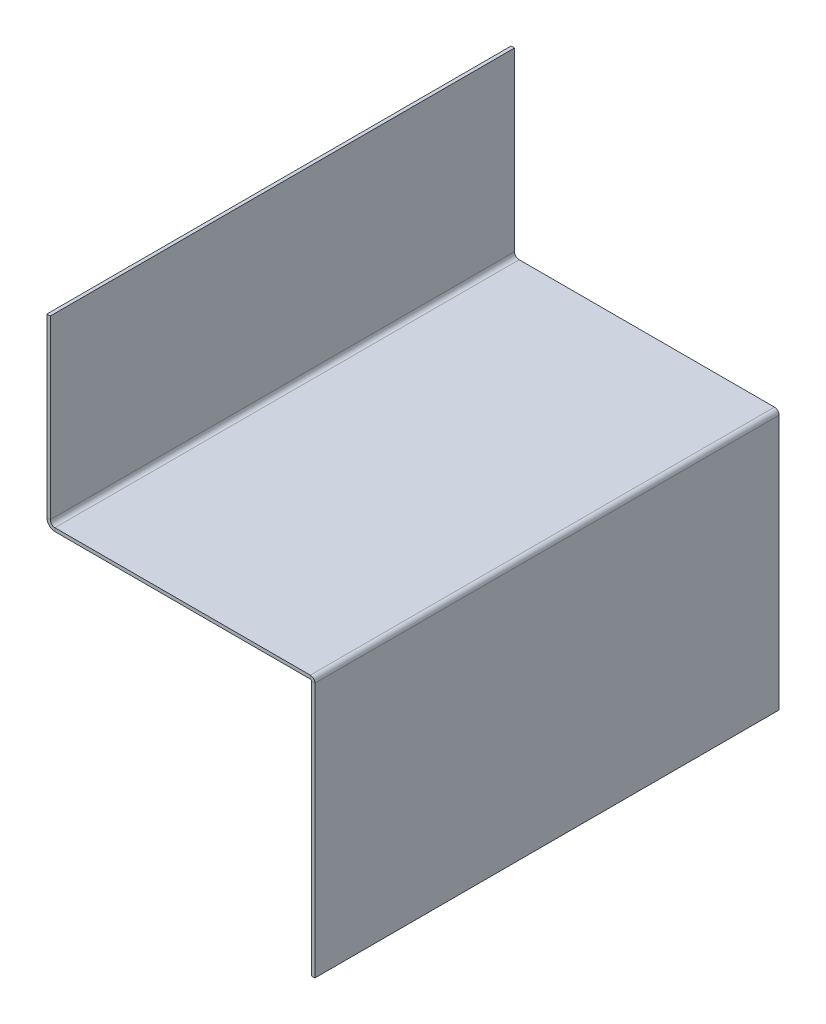
ISO-10303-21;
HEADER;
FILE_DESCRIPTION(('STEP AP214'),'2;1');
FILE_NAME('part.step','',(''),(''),'','','');
FILE_SCHEMA(('AUTOMOTIVE_DESIGN { 1 0 10303 214 1 1 1 1 }'));
ENDSEC;
DATA;
#1=APPLICATION_CONTEXT('core data for automotive mechanical design processes');
#2=APPLICATION_PROTOCOL_DEFINITION('international standard','automotive_design',2000,#1);
#3=PRODUCT_CONTEXT('',#1,'mechanical');
#4=PRODUCT('Part','Part','',(#3));
#5=PRODUCT_RELATED_PRODUCT_CATEGORY('part','',(#4));
#6=PRODUCT_DEFINITION_FORMATION('','',#4);
#7=PRODUCT_DEFINITION_CONTEXT('part definition',#1,'design');
#8=PRODUCT_DEFINITION('design','',#6,#7);
#9=PRODUCT_DEFINITION_SHAPE('','',#8);
#10=(LENGTH_UNIT() NAMED_UNIT(*) SI_UNIT(.MILLI.,.METRE.));
#11=(NAMED_UNIT(*) PLANE_ANGLE_UNIT() SI_UNIT($,.RADIAN.));
#12=(NAMED_UNIT(*) SI_UNIT($,.STERADIAN.) SOLID_ANGLE_UNIT());
#13=UNCERTAINTY_MEASURE_WITH_UNIT(LENGTH_MEASURE(1.E-05),#10,'distance_accuracy_value','');
#14=(GEOMETRIC_REPRESENTATION_CONTEXT(3) GLOBAL_UNCERTAINTY_ASSIGNED_CONTEXT((#13)) GLOBAL_UNIT_ASSIGNED_CONTEXT((#10,
#11,#12)) REPRESENTATION_CONTEXT('',''));
#15=CARTESIAN_POINT('',(0.,0.,0.));
#16=DIRECTION('',(0.,0.,1.));
#17=DIRECTION('',(1.,0.,0.));
#18=AXIS2_PLACEMENT_3D('',#15,#16,#17);
#19=CARTESIAN_POINT('',(1.00000000000001,0.,50.));
#20=DIRECTION('',(0.,0.,1.));
#21=DIRECTION('',(1.,0.,0.));
#22=AXIS2_PLACEMENT_3D('',#19,#20,#21);
#23=PLANE('',#22);
#24=DIRECTION('',(0.,-1.,0.));
#25=VECTOR('',#24,1.);
#26=CARTESIAN_POINT('',(1.00000000000001,0.,50.));
#27=LINE('',#26,#25);
#28=CARTESIAN_POINT('',(1.00000000000001,0.,50.));
#29=VERTEX_POINT('',#28);
#30=CARTESIAN_POINT('',(1.00000000000001,-0.7366,50.));
#31=VERTEX_POINT('',#30);
#32=EDGE_CURVE('E11',#29,#31,#27,.T.);
#33=ORIENTED_EDGE('',*,*,#32,.F.);
#34=CARTESIAN_POINT('',(1.,1.,50.));
#35=DIRECTION('',(0.,0.,1.));
#36=DIRECTION('',(-1.,0.,0.));
#37=AXIS2_PLACEMENT_3D('',#34,#35,#36);
#38=CIRCLE('',#37,1.);
#39=CARTESIAN_POINT('',(0.,1.00000000000001,50.));
#40=VERTEX_POINT('',#39);
#41=EDGE_CURVE('E247',#40,#29,#38,.T.);
#42=ORIENTED_EDGE('',*,*,#41,.F.);
#43=DIRECTION('',(1.,0.,0.));
#44=VECTOR('',#43,1.);
#45=CARTESIAN_POINT('',(-0.7366,1.00000000000001,50.));
#46=LINE('',#45,#44);
#47=CARTESIAN_POINT('',(-0.7366,1.00000000000001,50.));
#48=VERTEX_POINT('',#47);
#49=EDGE_CURVE('E45',#48,#40,#46,.T.);
#50=ORIENTED_EDGE('',*,*,#49,.F.);
#51=CARTESIAN_POINT('',(1.,1.,50.));
#52=DIRECTION('',(0.,0.,1.));
#53=DIRECTION('',(1.,0.,0.));
#54=AXIS2_PLACEMENT_3D('',#51,#52,#53);
#55=CIRCLE('',#54,1.7366);
#56=EDGE_CURVE('E146',#48,#31,#55,.T.);
#57=ORIENTED_EDGE('',*,*,#56,.T.);
#58=EDGE_LOOP('',(#33,#42,#50,#57));
#59=FACE_BOUND('',#58,.T.);
#60=ADVANCED_FACE('F37',(#59),#23,.T.);
#61=CARTESIAN_POINT('',(-0.7366,1.00000000000001,50.));
#62=DIRECTION('',(0.,0.,1.));
#63=DIRECTION('',(1.,0.,0.));
#64=AXIS2_PLACEMENT_3D('',#61,#62,#63);
#65=PLANE('',#64);
#66=DIRECTION('',(1.,0.,0.));
#67=VECTOR('',#66,1.);
#68=CARTESIAN_POINT('',(1.00000000000001,0.,50.));
#69=LINE('',#68,#67);
#70=CARTESIAN_POINT('',(56.,0.,50.));
#71=VERTEX_POINT('',#70);
#72=EDGE_CURVE('E140',#29,#71,#69,.T.);
#73=ORIENTED_EDGE('',*,*,#72,.F.);
#74=ORIENTED_EDGE('',*,*,#32,.T.);
#75=DIRECTION('',(1.,0.,0.));
#76=VECTOR('',#75,1.);
#77=CARTESIAN_POINT('',(1.00000000000001,-0.7366,50.));
#78=LINE('',#77,#76);
#79=CARTESIAN_POINT('',(56.,-0.7366,50.));
#80=VERTEX_POINT('',#79);
#81=EDGE_CURVE('E137',#31,#80,#78,.T.);
#82=ORIENTED_EDGE('',*,*,#81,.T.);
#83=DIRECTION('',(0.,1.,0.));
#84=VECTOR('',#83,1.);
#85=CARTESIAN_POINT('',(56.,-0.7366,50.));
#86=LINE('',#85,#84);
#87=EDGE_CURVE('E228',#80,#71,#86,.T.);
#88=ORIENTED_EDGE('',*,*,#87,.T.);
#89=EDGE_LOOP('',(#73,#74,#82,#88));
#90=FACE_BOUND('',#89,.T.);
#91=ADVANCED_FACE('F135',(#90),#65,.T.);
#92=CARTESIAN_POINT('',(0.,1.00000000000001,-50.));
#93=DIRECTION('',(0.,0.,-1.));
#94=DIRECTION('',(-1.,0.,0.));
#95=AXIS2_PLACEMENT_3D('',#92,#93,#94);
#96=PLANE('',#95);
#97=DIRECTION('',(-1.,0.,0.));
#98=VECTOR('',#97,1.);
#99=CARTESIAN_POINT('',(0.,1.00000000000001,-50.));
#100=LINE('',#99,#98);
#101=CARTESIAN_POINT('',(0.,1.00000000000001,-50.));
#102=VERTEX_POINT('',#101);
#103=CARTESIAN_POINT('',(-0.7366,1.00000000000001,-50.));
#104=VERTEX_POINT('',#103);
#105=EDGE_CURVE('E233',#102,#104,#100,.T.);
#106=ORIENTED_EDGE('',*,*,#105,.F.);
#107=CARTESIAN_POINT('',(1.,1.,-50.));
#108=DIRECTION('',(0.,0.,1.));
#109=DIRECTION('',(-1.,0.,0.));
#110=AXIS2_PLACEMENT_3D('',#107,#108,#109);
#111=CIRCLE('',#110,1.);
#112=CARTESIAN_POINT('',(1.00000000000001,0.,-50.));
#113=VERTEX_POINT('',#112);
#114=EDGE_CURVE('E185',#102,#113,#111,.T.);
#115=ORIENTED_EDGE('',*,*,#114,.T.);
#116=DIRECTION('',(0.,1.,0.));
#117=VECTOR('',#116,1.);
#118=CARTESIAN_POINT('',(1.00000000000001,-0.7366,-50.));
#119=LINE('',#118,#117);
#120=CARTESIAN_POINT('',(1.00000000000001,-0.7366,-50.));
#121=VERTEX_POINT('',#120);
#122=EDGE_CURVE('E231',#121,#113,#119,.T.);
#123=ORIENTED_EDGE('',*,*,#122,.F.);
#124=CARTESIAN_POINT('',(1.,1.,-50.));
#125=DIRECTION('',(0.,0.,1.));
#126=DIRECTION('',(1.,0.,0.));
#127=AXIS2_PLACEMENT_3D('',#124,#125,#126);
#128=CIRCLE('',#127,1.7366);
#129=EDGE_CURVE('E158',#104,#121,#128,.T.);
#130=ORIENTED_EDGE('',*,*,#129,.F.);
#131=EDGE_LOOP('',(#106,#115,#123,#130));
#132=FACE_BOUND('',#131,.T.);
#133=ADVANCED_FACE('F285',(#132),#96,.T.);
#134=CARTESIAN_POINT('',(1.00000000000001,-0.7366,-50.));
#135=DIRECTION('',(0.,0.,-1.));
#136=DIRECTION('',(-1.,0.,0.));
#137=AXIS2_PLACEMENT_3D('',#134,#135,#136);
#138=PLANE('',#137);
#139=DIRECTION('',(0.,-1.,0.));
#140=VECTOR('',#139,1.);
#141=CARTESIAN_POINT('',(0.,39.,-50.));
#142=LINE('',#141,#140);
#143=CARTESIAN_POINT('',(0.,39.,-50.));
#144=VERTEX_POINT('',#143);
#145=EDGE_CURVE('E188',#144,#102,#142,.T.);
#146=ORIENTED_EDGE('',*,*,#145,.T.);
#147=ORIENTED_EDGE('',*,*,#105,.T.);
#148=DIRECTION('',(0.,1.,0.));
#149=VECTOR('',#148,1.);
#150=CARTESIAN_POINT('',(-0.7366,39.,-50.));
#151=LINE('',#150,#149);
#152=CARTESIAN_POINT('',(-0.7366,39.,-50.));
#153=VERTEX_POINT('',#152);
#154=EDGE_CURVE('E194',#153,#104,#151,.F.);
#155=ORIENTED_EDGE('',*,*,#154,.F.);
#156=DIRECTION('',(1.,0.,0.));
#157=VECTOR('',#156,1.);
#158=CARTESIAN_POINT('',(-0.7366,39.,-50.));
#159=LINE('',#158,#157);
#160=EDGE_CURVE('E191',#153,#144,#159,.T.);
#161=ORIENTED_EDGE('',*,*,#160,.T.);
#162=EDGE_LOOP('',(#146,#147,#155,#161));
#163=FACE_BOUND('',#162,.T.);
#164=ADVANCED_FACE('F288',(#163),#138,.T.);
#165=CARTESIAN_POINT('',(57.,-1.00000000000001,50.));
#166=DIRECTION('',(0.,0.,1.));
#167=DIRECTION('',(1.,0.,0.));
#168=AXIS2_PLACEMENT_3D('',#165,#166,#167);
#169=PLANE('',#168);
#170=DIRECTION('',(-1.,0.,0.));
#171=VECTOR('',#170,1.);
#172=CARTESIAN_POINT('',(57.,-1.00000000000001,50.));
#173=LINE('',#172,#171);
#174=CARTESIAN_POINT('',(57.,-1.00000000000001,50.));
#175=VERTEX_POINT('',#174);
#176=CARTESIAN_POINT('',(56.2634,-1.00000000000001,50.));
#177=VERTEX_POINT('',#176);
#178=EDGE_CURVE('E53',#175,#177,#173,.T.);
#179=ORIENTED_EDGE('',*,*,#178,.F.);
#180=CARTESIAN_POINT('',(56.,-1.,50.));
#181=DIRECTION('',(0.,0.,-1.));
#182=DIRECTION('',(1.,0.,0.));
#183=AXIS2_PLACEMENT_3D('',#180,#181,#182);
#184=CIRCLE('',#183,1.);
#185=EDGE_CURVE('E257',#71,#175,#184,.T.);
#186=ORIENTED_EDGE('',*,*,#185,.F.);
#187=ORIENTED_EDGE('',*,*,#87,.F.);
#188=CARTESIAN_POINT('',(56.,-1.,50.));
#189=DIRECTION('',(0.,0.,1.));
#190=DIRECTION('',(1.,0.,0.));
#191=AXIS2_PLACEMENT_3D('',#188,#189,#190);
#192=CIRCLE('',#191,0.2634);
#193=EDGE_CURVE('E166',#80,#177,#192,.F.);
#194=ORIENTED_EDGE('',*,*,#193,.T.);
#195=EDGE_LOOP('',(#179,#186,#187,#194));
#196=FACE_BOUND('',#195,.T.);
#197=ADVANCED_FACE('F280',(#196),#169,.T.);
#198=CARTESIAN_POINT('',(56.,-0.7366,50.));
#199=DIRECTION('',(0.,0.,1.));
#200=DIRECTION('',(1.,0.,0.));
#201=AXIS2_PLACEMENT_3D('',#198,#199,#200);
#202=PLANE('',#201);
#203=DIRECTION('',(0.,-1.,0.));
#204=VECTOR('',#203,1.);
#205=CARTESIAN_POINT('',(57.,-1.00000000000001,50.));
#206=LINE('',#205,#204);
#207=CARTESIAN_POINT('',(57.,-56.,50.));
#208=VERTEX_POINT('',#207);
#209=EDGE_CURVE('E260',#175,#208,#206,.T.);
#210=ORIENTED_EDGE('',*,*,#209,.F.);
#211=ORIENTED_EDGE('',*,*,#178,.T.);
#212=DIRECTION('',(0.,-1.,0.));
#213=VECTOR('',#212,1.);
#214=CARTESIAN_POINT('',(56.2634,-1.00000000000001,50.));
#215=LINE('',#214,#213);
#216=CARTESIAN_POINT('',(56.2634,-56.,50.));
#217=VERTEX_POINT('',#216);
#218=EDGE_CURVE('E107',#177,#217,#215,.T.);
#219=ORIENTED_EDGE('',*,*,#218,.T.);
#220=DIRECTION('',(-1.,0.,0.));
#221=VECTOR('',#220,1.);
#222=CARTESIAN_POINT('',(57.,-56.,50.));
#223=LINE('',#222,#221);
#224=EDGE_CURVE('E263',#208,#217,#223,.T.);
#225=ORIENTED_EDGE('',*,*,#224,.F.);
#226=EDGE_LOOP('',(#210,#211,#219,#225));
#227=FACE_BOUND('',#226,.T.);
#228=ADVANCED_FACE('F269',(#227),#202,.T.);
#229=CARTESIAN_POINT('',(56.,0.,-50.));
#230=DIRECTION('',(0.,0.,-1.));
#231=DIRECTION('',(-1.,0.,0.));
#232=AXIS2_PLACEMENT_3D('',#229,#230,#231);
#233=PLANE('',#232);
#234=DIRECTION('',(0.,-1.,0.));
#235=VECTOR('',#234,1.);
#236=CARTESIAN_POINT('',(56.,0.,-50.));
#237=LINE('',#236,#235);
#238=CARTESIAN_POINT('',(56.,0.,-50.));
#239=VERTEX_POINT('',#238);
#240=CARTESIAN_POINT('',(56.,-0.7366,-50.));
#241=VERTEX_POINT('',#240);
#242=EDGE_CURVE('E94',#239,#241,#237,.T.);
#243=ORIENTED_EDGE('',*,*,#242,.F.);
#244=CARTESIAN_POINT('',(56.,-1.,-50.));
#245=DIRECTION('',(0.,0.,-1.));
#246=DIRECTION('',(1.,0.,0.));
#247=AXIS2_PLACEMENT_3D('',#244,#245,#246);
#248=CIRCLE('',#247,1.);
#249=CARTESIAN_POINT('',(57.,-1.00000000000001,-50.));
#250=VERTEX_POINT('',#249);
#251=EDGE_CURVE('E181',#239,#250,#248,.T.);
#252=ORIENTED_EDGE('',*,*,#251,.T.);
#253=DIRECTION('',(1.,0.,0.));
#254=VECTOR('',#253,1.);
#255=CARTESIAN_POINT('',(56.2634,-1.00000000000001,-50.));
#256=LINE('',#255,#254);
#257=CARTESIAN_POINT('',(56.2634,-1.00000000000001,-50.));
#258=VERTEX_POINT('',#257);
#259=EDGE_CURVE('E101',#258,#250,#256,.T.);
#260=ORIENTED_EDGE('',*,*,#259,.F.);
#261=CARTESIAN_POINT('',(56.,-1.,-50.));
#262=DIRECTION('',(0.,0.,1.));
#263=DIRECTION('',(1.,0.,0.));
#264=AXIS2_PLACEMENT_3D('',#261,#262,#263);
#265=CIRCLE('',#264,0.2634);
#266=EDGE_CURVE('E200',#241,#258,#265,.F.);
#267=ORIENTED_EDGE('',*,*,#266,.F.);
#268=EDGE_LOOP('',(#243,#252,#260,#267));
#269=FACE_BOUND('',#268,.T.);
#270=ADVANCED_FACE('F317',(#269),#233,.T.);
#271=CARTESIAN_POINT('',(56.2634,-1.00000000000001,-50.));
#272=DIRECTION('',(0.,0.,-1.));
#273=DIRECTION('',(-1.,0.,0.));
#274=AXIS2_PLACEMENT_3D('',#271,#272,#273);
#275=PLANE('',#274);
#276=DIRECTION('',(1.,0.,0.));
#277=VECTOR('',#276,1.);
#278=CARTESIAN_POINT('',(1.00000000000001,0.,-50.));
#279=LINE('',#278,#277);
#280=EDGE_CURVE('E183',#113,#239,#279,.T.);
#281=ORIENTED_EDGE('',*,*,#280,.T.);
#282=ORIENTED_EDGE('',*,*,#242,.T.);
#283=DIRECTION('',(1.,0.,0.));
#284=VECTOR('',#283,1.);
#285=CARTESIAN_POINT('',(1.00000000000001,-0.7366,-50.));
#286=LINE('',#285,#284);
#287=EDGE_CURVE('E198',#121,#241,#286,.T.);
#288=ORIENTED_EDGE('',*,*,#287,.F.);
#289=ORIENTED_EDGE('',*,*,#122,.T.);
#290=EDGE_LOOP('',(#281,#282,#288,#289));
#291=FACE_BOUND('',#290,.T.);
#292=ADVANCED_FACE('F320',(#291),#275,.T.);
#293=CARTESIAN_POINT('',(56.2634,-1.00000000000001,50.));
#294=DIRECTION('',(1.,0.,0.));
#295=DIRECTION('',(0.,1.,0.));
#296=AXIS2_PLACEMENT_3D('',#293,#294,#295);
#297=PLANE('',#296);
#298=DIRECTION('',(0.,-1.,0.));
#299=VECTOR('',#298,1.);
#300=CARTESIAN_POINT('',(56.2634,-1.00000000000001,-50.));
#301=LINE('',#300,#299);
#302=CARTESIAN_POINT('',(56.2634,-56.,-50.));
#303=VERTEX_POINT('',#302);
#304=EDGE_CURVE('E172',#258,#303,#301,.T.);
#305=ORIENTED_EDGE('',*,*,#304,.T.);
#306=DIRECTION('',(0.,0.,-1.));
#307=VECTOR('',#306,1.);
#308=CARTESIAN_POINT('',(56.2634,-56.,50.));
#309=LINE('',#308,#307);
#310=EDGE_CURVE('E224',#217,#303,#309,.T.);
#311=ORIENTED_EDGE('',*,*,#310,.F.);
#312=ORIENTED_EDGE('',*,*,#218,.F.);
#313=DIRECTION('',(0.,0.,-1.));
#314=VECTOR('',#313,1.);
#315=CARTESIAN_POINT('',(56.2634,-1.00000000000001,50.));
#316=LINE('',#315,#314);
#317=EDGE_CURVE('E168',#177,#258,#316,.T.);
#318=ORIENTED_EDGE('',*,*,#317,.T.);
#319=EDGE_LOOP('',(#305,#311,#312,#318));
#320=FACE_BOUND('',#319,.T.);
#321=ADVANCED_FACE('F323',(#320),#297,.F.);
#322=CARTESIAN_POINT('',(57.,-56.,50.));
#323=DIRECTION('',(0.,-1.,0.));
#324=DIRECTION('',(0.,0.,-1.));
#325=AXIS2_PLACEMENT_3D('',#322,#323,#324);
#326=PLANE('',#325);
#327=DIRECTION('',(-1.,0.,0.));
#328=VECTOR('',#327,1.);
#329=CARTESIAN_POINT('',(57.,-56.,-50.));
#330=LINE('',#329,#328);
#331=CARTESIAN_POINT('',(57.,-56.,-50.));
#332=VERTEX_POINT('',#331);
#333=EDGE_CURVE('E175',#332,#303,#330,.T.);
#334=ORIENTED_EDGE('',*,*,#333,.F.);
#335=DIRECTION('',(0.,0.,-1.));
#336=VECTOR('',#335,1.);
#337=CARTESIAN_POINT('',(57.,-56.,50.));
#338=LINE('',#337,#336);
#339=EDGE_CURVE('E222',#208,#332,#338,.T.);
#340=ORIENTED_EDGE('',*,*,#339,.F.);
#341=ORIENTED_EDGE('',*,*,#224,.T.);
#342=ORIENTED_EDGE('',*,*,#310,.T.);
#343=EDGE_LOOP('',(#334,#340,#341,#342));
#344=FACE_BOUND('',#343,.T.);
#345=ADVANCED_FACE('F268',(#344),#326,.T.);
#346=CARTESIAN_POINT('',(57.,-1.00000000000001,50.));
#347=DIRECTION('',(1.,0.,0.));
#348=DIRECTION('',(0.,1.,0.));
#349=AXIS2_PLACEMENT_3D('',#346,#347,#348);
#350=PLANE('',#349);
#351=DIRECTION('',(0.,-1.,0.));
#352=VECTOR('',#351,1.);
#353=CARTESIAN_POINT('',(57.,-1.00000000000001,-50.));
#354=LINE('',#353,#352);
#355=EDGE_CURVE('E178',#250,#332,#354,.T.);
#356=ORIENTED_EDGE('',*,*,#355,.F.);
#357=DIRECTION('',(0.,0.,-1.));
#358=VECTOR('',#357,1.);
#359=CARTESIAN_POINT('',(57.,-1.00000000000001,50.));
#360=LINE('',#359,#358);
#361=EDGE_CURVE('E219',#175,#250,#360,.T.);
#362=ORIENTED_EDGE('',*,*,#361,.F.);
#363=ORIENTED_EDGE('',*,*,#209,.T.);
#364=ORIENTED_EDGE('',*,*,#339,.T.);
#365=EDGE_LOOP('',(#356,#362,#363,#364));
#366=FACE_BOUND('',#365,.T.);
#367=ADVANCED_FACE('F273',(#366),#350,.T.);
#368=CARTESIAN_POINT('',(56.,-1.,50.));
#369=DIRECTION('',(0.,0.,-1.));
#370=DIRECTION('',(-1.,0.,0.));
#371=AXIS2_PLACEMENT_3D('',#368,#369,#370);
#372=CYLINDRICAL_SURFACE('',#371,1.);
#373=ORIENTED_EDGE('',*,*,#251,.F.);
#374=DIRECTION('',(0.,0.,-1.));
#375=VECTOR('',#374,1.);
#376=CARTESIAN_POINT('',(56.,0.,50.));
#377=LINE('',#376,#375);
#378=EDGE_CURVE('E216',#71,#239,#377,.T.);
#379=ORIENTED_EDGE('',*,*,#378,.F.);
#380=ORIENTED_EDGE('',*,*,#185,.T.);
#381=ORIENTED_EDGE('',*,*,#361,.T.);
#382=EDGE_LOOP('',(#373,#379,#380,#381));
#383=FACE_BOUND('',#382,.T.);
#384=ADVANCED_FACE('F276',(#383),#372,.T.);
#385=CARTESIAN_POINT('',(1.00000000000001,0.,50.));
#386=DIRECTION('',(0.,1.,0.));
#387=DIRECTION('',(0.,0.,1.));
#388=AXIS2_PLACEMENT_3D('',#385,#386,#387);
#389=PLANE('',#388);
#390=ORIENTED_EDGE('',*,*,#280,.F.);
#391=DIRECTION('',(0.,0.,-1.));
#392=VECTOR('',#391,1.);
#393=CARTESIAN_POINT('',(1.00000000000001,0.,50.));
#394=LINE('',#393,#392);
#395=EDGE_CURVE('E213',#29,#113,#394,.T.);
#396=ORIENTED_EDGE('',*,*,#395,.F.);
#397=ORIENTED_EDGE('',*,*,#72,.T.);
#398=ORIENTED_EDGE('',*,*,#378,.T.);
#399=EDGE_LOOP('',(#390,#396,#397,#398));
#400=FACE_BOUND('',#399,.T.);
#401=ADVANCED_FACE('F283',(#400),#389,.T.);
#402=CARTESIAN_POINT('',(1.,1.,50.));
#403=DIRECTION('',(0.,0.,-1.));
#404=DIRECTION('',(-1.,0.,0.));
#405=AXIS2_PLACEMENT_3D('',#402,#403,#404);
#406=CYLINDRICAL_SURFACE('',#405,1.);
#407=ORIENTED_EDGE('',*,*,#114,.F.);
#408=DIRECTION('',(0.,0.,-1.));
#409=VECTOR('',#408,1.);
#410=CARTESIAN_POINT('',(0.,1.00000000000001,50.));
#411=LINE('',#410,#409);
#412=EDGE_CURVE('E210',#40,#102,#411,.T.);
#413=ORIENTED_EDGE('',*,*,#412,.F.);
#414=ORIENTED_EDGE('',*,*,#41,.T.);
#415=ORIENTED_EDGE('',*,*,#395,.T.);
#416=EDGE_LOOP('',(#407,#413,#414,#415));
#417=FACE_BOUND('',#416,.T.);
#418=ADVANCED_FACE('F246',(#417),#406,.F.);
#419=CARTESIAN_POINT('',(0.,39.,50.));
#420=DIRECTION('',(1.,0.,0.));
#421=DIRECTION('',(0.,0.,-1.));
#422=AXIS2_PLACEMENT_3D('',#419,#420,#421);
#423=PLANE('',#422);
#424=ORIENTED_EDGE('',*,*,#145,.F.);
#425=DIRECTION('',(0.,0.,-1.));
#426=VECTOR('',#425,1.);
#427=CARTESIAN_POINT('',(0.,39.,50.));
#428=LINE('',#427,#426);
#429=CARTESIAN_POINT('',(0.,39.,50.));
#430=VERTEX_POINT('',#429);
#431=EDGE_CURVE('E208',#430,#144,#428,.T.);
#432=ORIENTED_EDGE('',*,*,#431,.F.);
#433=DIRECTION('',(0.,-1.,0.));
#434=VECTOR('',#433,1.);
#435=CARTESIAN_POINT('',(0.,39.,50.));
#436=LINE('',#435,#434);
#437=EDGE_CURVE('E240',#430,#40,#436,.T.);
#438=ORIENTED_EDGE('',*,*,#437,.T.);
#439=ORIENTED_EDGE('',*,*,#412,.T.);
#440=EDGE_LOOP('',(#424,#432,#438,#439));
#441=FACE_BOUND('',#440,.T.);
#442=ADVANCED_FACE('F251',(#441),#423,.T.);
#443=CARTESIAN_POINT('',(-0.7366,39.,50.));
#444=DIRECTION('',(0.,1.,0.));
#445=DIRECTION('',(0.,0.,1.));
#446=AXIS2_PLACEMENT_3D('',#443,#444,#445);
#447=PLANE('',#446);
#448=ORIENTED_EDGE('',*,*,#160,.F.);
#449=DIRECTION('',(0.,0.,-1.));
#450=VECTOR('',#449,1.);
#451=CARTESIAN_POINT('',(-0.7366,39.,50.));
#452=LINE('',#451,#450);
#453=CARTESIAN_POINT('',(-0.7366,39.,50.));
#454=VERTEX_POINT('',#453);
#455=EDGE_CURVE('E206',#454,#153,#452,.T.);
#456=ORIENTED_EDGE('',*,*,#455,.F.);
#457=DIRECTION('',(1.,0.,0.));
#458=VECTOR('',#457,1.);
#459=CARTESIAN_POINT('',(-0.7366,39.,50.));
#460=LINE('',#459,#458);
#461=EDGE_CURVE('E252',#454,#430,#460,.T.);
#462=ORIENTED_EDGE('',*,*,#461,.T.);
#463=ORIENTED_EDGE('',*,*,#431,.T.);
#464=EDGE_LOOP('',(#448,#456,#462,#463));
#465=FACE_BOUND('',#464,.T.);
#466=ADVANCED_FACE('F293',(#465),#447,.T.);
#467=CARTESIAN_POINT('',(-0.7366,39.,50.));
#468=DIRECTION('',(1.,0.,0.));
#469=DIRECTION('',(0.,0.,-1.));
#470=AXIS2_PLACEMENT_3D('',#467,#468,#469);
#471=PLANE('',#470);
#472=ORIENTED_EDGE('',*,*,#154,.T.);
#473=DIRECTION('',(0.,0.,-1.));
#474=VECTOR('',#473,1.);
#475=CARTESIAN_POINT('',(-0.7366,1.00000000000001,50.));
#476=LINE('',#475,#474);
#477=EDGE_CURVE('E160',#48,#104,#476,.T.);
#478=ORIENTED_EDGE('',*,*,#477,.F.);
#479=DIRECTION('',(0.,1.,0.));
#480=VECTOR('',#479,1.);
#481=CARTESIAN_POINT('',(-0.7366,39.,50.));
#482=LINE('',#481,#480);
#483=EDGE_CURVE('E151',#454,#48,#482,.F.);
#484=ORIENTED_EDGE('',*,*,#483,.F.);
#485=ORIENTED_EDGE('',*,*,#455,.T.);
#486=EDGE_LOOP('',(#472,#478,#484,#485));
#487=FACE_BOUND('',#486,.T.);
#488=ADVANCED_FACE('F291',(#487),#471,.F.);
#489=CARTESIAN_POINT('',(1.,1.,50.));
#490=DIRECTION('',(0.,0.,-1.));
#491=DIRECTION('',(-1.,0.,0.));
#492=AXIS2_PLACEMENT_3D('',#489,#490,#491);
#493=CYLINDRICAL_SURFACE('',#492,1.7366);
#494=ORIENTED_EDGE('',*,*,#129,.T.);
#495=DIRECTION('',(0.,0.,-1.));
#496=VECTOR('',#495,1.);
#497=CARTESIAN_POINT('',(1.00000000000001,-0.7366,50.));
#498=LINE('',#497,#496);
#499=EDGE_CURVE('E155',#31,#121,#498,.T.);
#500=ORIENTED_EDGE('',*,*,#499,.F.);
#501=ORIENTED_EDGE('',*,*,#56,.F.);
#502=ORIENTED_EDGE('',*,*,#477,.T.);
#503=EDGE_LOOP('',(#494,#500,#501,#502));
#504=FACE_BOUND('',#503,.T.);
#505=ADVANCED_FACE('F156',(#504),#493,.T.);
#506=CARTESIAN_POINT('',(1.00000000000001,-0.7366,50.));
#507=DIRECTION('',(0.,1.,0.));
#508=DIRECTION('',(0.,0.,1.));
#509=AXIS2_PLACEMENT_3D('',#506,#507,#508);
#510=PLANE('',#509);
#511=ORIENTED_EDGE('',*,*,#287,.T.);
#512=DIRECTION('',(0.,0.,-1.));
#513=VECTOR('',#512,1.);
#514=CARTESIAN_POINT('',(56.,-0.7366,50.));
#515=LINE('',#514,#513);
#516=EDGE_CURVE('E161',#80,#241,#515,.T.);
#517=ORIENTED_EDGE('',*,*,#516,.F.);
#518=ORIENTED_EDGE('',*,*,#81,.F.);
#519=ORIENTED_EDGE('',*,*,#499,.T.);
#520=EDGE_LOOP('',(#511,#517,#518,#519));
#521=FACE_BOUND('',#520,.T.);
#522=ADVANCED_FACE('F163',(#521),#510,.F.);
#523=CARTESIAN_POINT('',(56.,-1.,50.));
#524=DIRECTION('',(0.,0.,-1.));
#525=DIRECTION('',(-1.,0.,0.));
#526=AXIS2_PLACEMENT_3D('',#523,#524,#525);
#527=CYLINDRICAL_SURFACE('',#526,0.2634);
#528=ORIENTED_EDGE('',*,*,#266,.T.);
#529=ORIENTED_EDGE('',*,*,#317,.F.);
#530=ORIENTED_EDGE('',*,*,#193,.F.);
#531=ORIENTED_EDGE('',*,*,#516,.T.);
#532=EDGE_LOOP('',(#528,#529,#530,#531));
#533=FACE_BOUND('',#532,.T.);
#534=ADVANCED_FACE('F375',(#533),#527,.F.);
#535=CARTESIAN_POINT('',(56.,-1.,50.));
#536=DIRECTION('',(0.,0.,-1.));
#537=DIRECTION('',(-1.,0.,0.));
#538=AXIS2_PLACEMENT_3D('',#535,#536,#537);
#539=PLANE('',#538);
#540=ORIENTED_EDGE('',*,*,#483,.T.);
#541=ORIENTED_EDGE('',*,*,#49,.T.);
#542=ORIENTED_EDGE('',*,*,#437,.F.);
#543=ORIENTED_EDGE('',*,*,#461,.F.);
#544=EDGE_LOOP('',(#540,#541,#542,#543));
#545=FACE_BOUND('',#544,.T.);
#546=ADVANCED_FACE('F237',(#545),#539,.F.);
#547=CARTESIAN_POINT('',(56.,-1.,-50.));
#548=DIRECTION('',(0.,0.,-1.));
#549=DIRECTION('',(-1.,0.,0.));
#550=AXIS2_PLACEMENT_3D('',#547,#548,#549);
#551=PLANE('',#550);
#552=ORIENTED_EDGE('',*,*,#304,.F.);
#553=ORIENTED_EDGE('',*,*,#259,.T.);
#554=ORIENTED_EDGE('',*,*,#355,.T.);
#555=ORIENTED_EDGE('',*,*,#333,.T.);
#556=EDGE_LOOP('',(#552,#553,#554,#555));
#557=FACE_BOUND('',#556,.T.);
#558=ADVANCED_FACE('F395',(#557),#551,.T.);
#559=CLOSED_SHELL('',(#60,#91,#133,#164,#197,#228,#270,#292,#321,#345,#367,#384,#401,#418,#442,
#466,#488,#505,#522,#534,#546,#558));
#560=MANIFOLD_SOLID_BREP('B2',#559);
#561=ADVANCED_BREP_SHAPE_REPRESENTATION('',(#18,#560),#14);
#562=SHAPE_DEFINITION_REPRESENTATION(#9,#561);
ENDSEC;
END-ISO-10303-21;
